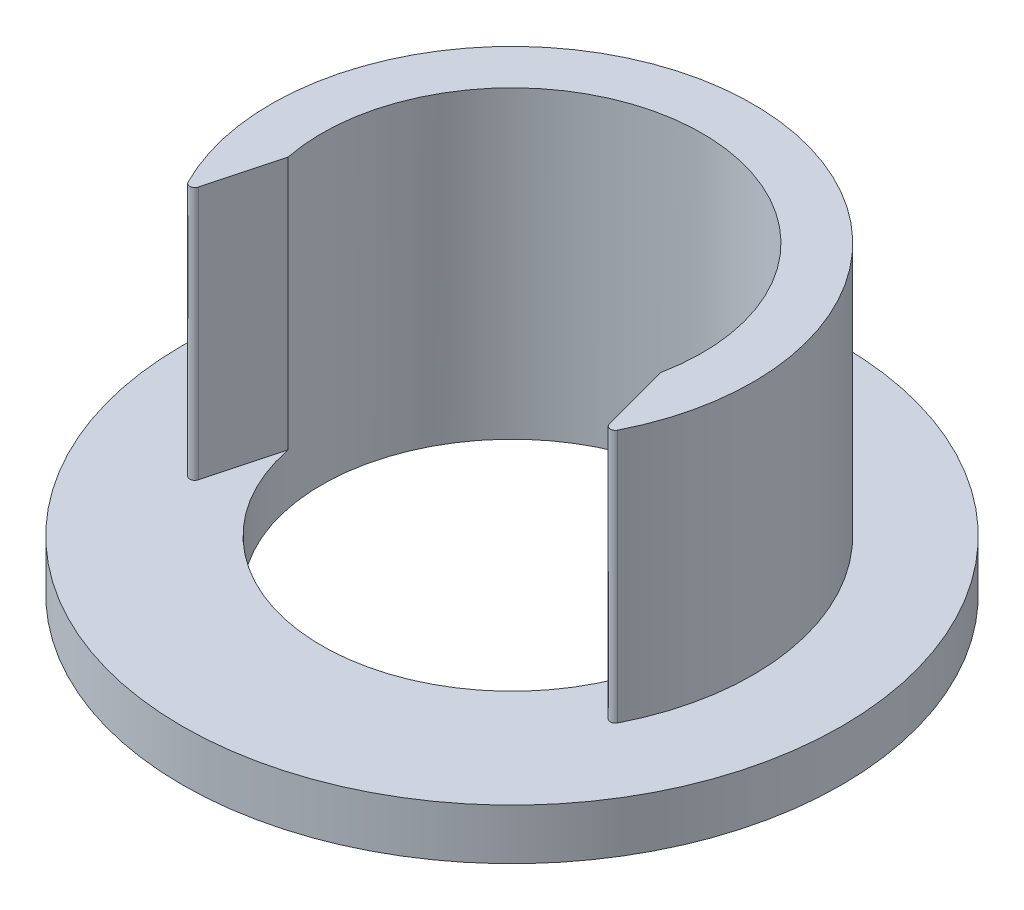
ISO-10303-21;
HEADER;
FILE_DESCRIPTION(('STEP AP214'),'2;1');
FILE_NAME('part.step','',(''),(''),'','','');
FILE_SCHEMA(('AUTOMOTIVE_DESIGN { 1 0 10303 214 1 1 1 1 }'));
ENDSEC;
DATA;
#1=APPLICATION_CONTEXT('core data for automotive mechanical design processes');
#2=APPLICATION_PROTOCOL_DEFINITION('international standard','automotive_design',2000,#1);
#3=PRODUCT_CONTEXT('',#1,'mechanical');
#4=PRODUCT('Part','Part','',(#3));
#5=PRODUCT_RELATED_PRODUCT_CATEGORY('part','',(#4));
#6=PRODUCT_DEFINITION_FORMATION('','',#4);
#7=PRODUCT_DEFINITION_CONTEXT('part definition',#1,'design');
#8=PRODUCT_DEFINITION('design','',#6,#7);
#9=PRODUCT_DEFINITION_SHAPE('','',#8);
#10=(LENGTH_UNIT() NAMED_UNIT(*) SI_UNIT(.MILLI.,.METRE.));
#11=(NAMED_UNIT(*) PLANE_ANGLE_UNIT() SI_UNIT($,.RADIAN.));
#12=(NAMED_UNIT(*) SI_UNIT($,.STERADIAN.) SOLID_ANGLE_UNIT());
#13=UNCERTAINTY_MEASURE_WITH_UNIT(LENGTH_MEASURE(1.E-05),#10,'distance_accuracy_value','');
#14=(GEOMETRIC_REPRESENTATION_CONTEXT(3) GLOBAL_UNCERTAINTY_ASSIGNED_CONTEXT((#13)) GLOBAL_UNIT_ASSIGNED_CONTEXT((#10,
#11,#12)) REPRESENTATION_CONTEXT('',''));
#15=CARTESIAN_POINT('',(0.,0.,0.));
#16=DIRECTION('',(0.,0.,1.));
#17=DIRECTION('',(1.,0.,0.));
#18=AXIS2_PLACEMENT_3D('',#15,#16,#17);
#19=CARTESIAN_POINT('',(0.,10.,0.));
#20=DIRECTION('',(0.,1.,0.));
#21=DIRECTION('',(0.,0.,1.));
#22=AXIS2_PLACEMENT_3D('',#19,#20,#21);
#23=PLANE('',#22);
#24=CARTESIAN_POINT('',(0.,10.,0.));
#25=DIRECTION('',(0.,1.,0.));
#26=DIRECTION('',(0.,0.,-1.));
#27=AXIS2_PLACEMENT_3D('',#24,#25,#26);
#28=CIRCLE('',#27,47.5);
#29=CARTESIAN_POINT('',(42.3445197758314,10.,21.5218875787935));
#30=VERTEX_POINT('',#29);
#31=CARTESIAN_POINT('',(-42.3445197758314,10.,21.5218875787935));
#32=VERTEX_POINT('',#31);
#33=EDGE_CURVE('E159',#30,#32,#28,.T.);
#34=ORIENTED_EDGE('',*,*,#33,.F.);
#35=CARTESIAN_POINT('',(41.4530562016034,10.,21.0687952087136));
#36=DIRECTION('',(0.,1.,0.));
#37=DIRECTION('',(0.,0.,1.));
#38=AXIS2_PLACEMENT_3D('',#35,#36,#37);
#39=CIRCLE('',#38,1.);
#40=CARTESIAN_POINT('',(40.4871303753143,10.,21.3276142538161));
#41=VERTEX_POINT('',#40);
#42=EDGE_CURVE('E48',#30,#41,#39,.F.);
#43=ORIENTED_EDGE('',*,*,#42,.T.);
#44=DIRECTION('',(0.258819045102521,0.,0.965925826289068));
#45=VECTOR('',#44,1.);
#46=CARTESIAN_POINT('',(41.1362066797609,10.,23.7499999999999));
#47=LINE('',#46,#45);
#48=CARTESIAN_POINT('',(36.7594492813252,10.,7.4157190166349));
#49=VERTEX_POINT('',#48);
#50=EDGE_CURVE('E131',#41,#49,#47,.F.);
#51=ORIENTED_EDGE('',*,*,#50,.T.);
#52=CARTESIAN_POINT('',(0.,10.,0.));
#53=DIRECTION('',(0.,1.,0.));
#54=DIRECTION('',(0.,0.,1.));
#55=AXIS2_PLACEMENT_3D('',#52,#53,#54);
#56=CIRCLE('',#55,37.5);
#57=CARTESIAN_POINT('',(-36.7594492813252,10.,7.41571901663502));
#58=VERTEX_POINT('',#57);
#59=EDGE_CURVE('E175',#58,#49,#56,.T.);
#60=ORIENTED_EDGE('',*,*,#59,.F.);
#61=DIRECTION('',(0.258819045102525,0.,-0.965925826289067));
#62=VECTOR('',#61,1.);
#63=CARTESIAN_POINT('',(-36.7594492813252,10.,7.41571901663503));
#64=LINE('',#63,#62);
#65=CARTESIAN_POINT('',(-40.4871303753143,10.,21.3276142538161));
#66=VERTEX_POINT('',#65);
#67=EDGE_CURVE('E117',#58,#66,#64,.F.);
#68=ORIENTED_EDGE('',*,*,#67,.T.);
#69=CARTESIAN_POINT('',(-41.4530562016034,10.,21.0687952087136));
#70=DIRECTION('',(0.,1.,0.));
#71=DIRECTION('',(0.,0.,1.));
#72=AXIS2_PLACEMENT_3D('',#69,#70,#71);
#73=CIRCLE('',#72,1.);
#74=EDGE_CURVE('E11',#66,#32,#73,.F.);
#75=ORIENTED_EDGE('',*,*,#74,.T.);
#76=EDGE_LOOP('',(#34,#43,#51,#60,#68,#75));
#77=FACE_BOUND('',#76,.T.);
#78=CARTESIAN_POINT('',(0.,10.,0.));
#79=DIRECTION('',(0.,1.,0.));
#80=DIRECTION('',(0.,0.,1.));
#81=AXIS2_PLACEMENT_3D('',#78,#79,#80);
#82=CIRCLE('',#81,65.);
#83=CARTESIAN_POINT('',(0.,10.,65.));
#84=VERTEX_POINT('',#83);
#85=EDGE_CURVE('E119',#84,#84,#82,.T.);
#86=ORIENTED_EDGE('',*,*,#85,.T.);
#87=EDGE_LOOP('',(#86));
#88=FACE_BOUND('',#87,.T.);
#89=ADVANCED_FACE('F39',(#77,#88),#23,.T.);
#90=CARTESIAN_POINT('',(0.,0.,0.));
#91=DIRECTION('',(0.,1.,0.));
#92=DIRECTION('',(0.,0.,1.));
#93=AXIS2_PLACEMENT_3D('',#90,#91,#92);
#94=PLANE('',#93);
#95=CARTESIAN_POINT('',(0.,0.,0.));
#96=DIRECTION('',(0.,1.,0.));
#97=DIRECTION('',(0.,0.,1.));
#98=AXIS2_PLACEMENT_3D('',#95,#96,#97);
#99=CIRCLE('',#98,65.);
#100=CARTESIAN_POINT('',(0.,0.,65.));
#101=VERTEX_POINT('',#100);
#102=EDGE_CURVE('E125',#101,#101,#99,.T.);
#103=ORIENTED_EDGE('',*,*,#102,.F.);
#104=EDGE_LOOP('',(#103));
#105=FACE_BOUND('',#104,.T.);
#106=CARTESIAN_POINT('',(0.,0.,0.));
#107=DIRECTION('',(0.,1.,0.));
#108=DIRECTION('',(0.,0.,1.));
#109=AXIS2_PLACEMENT_3D('',#106,#107,#108);
#110=CIRCLE('',#109,37.5);
#111=CARTESIAN_POINT('',(0.,0.,37.5));
#112=VERTEX_POINT('',#111);
#113=EDGE_CURVE('E111',#112,#112,#110,.T.);
#114=ORIENTED_EDGE('',*,*,#113,.T.);
#115=EDGE_LOOP('',(#114));
#116=FACE_BOUND('',#115,.T.);
#117=ADVANCED_FACE('F182',(#105,#116),#94,.F.);
#118=CARTESIAN_POINT('',(0.,10.,0.));
#119=DIRECTION('',(0.,-1.,0.));
#120=DIRECTION('',(0.,0.,-1.));
#121=AXIS2_PLACEMENT_3D('',#118,#119,#120);
#122=CYLINDRICAL_SURFACE('',#121,65.);
#123=ORIENTED_EDGE('',*,*,#85,.F.);
#124=EDGE_LOOP('',(#123));
#125=FACE_BOUND('',#124,.T.);
#126=ORIENTED_EDGE('',*,*,#102,.T.);
#127=EDGE_LOOP('',(#126));
#128=FACE_BOUND('',#127,.T.);
#129=ADVANCED_FACE('F184',(#125,#128),#122,.T.);
#130=CARTESIAN_POINT('',(0.,10.,0.));
#131=DIRECTION('',(0.,-1.,0.));
#132=DIRECTION('',(0.,0.,-1.));
#133=AXIS2_PLACEMENT_3D('',#130,#131,#132);
#134=CYLINDRICAL_SURFACE('',#133,37.5);
#135=ORIENTED_EDGE('',*,*,#59,.T.);
#136=DIRECTION('',(0.,-1.,0.));
#137=VECTOR('',#136,1.);
#138=CARTESIAN_POINT('',(36.7594492813252,10.,7.4157190166349));
#139=LINE('',#138,#137);
#140=CARTESIAN_POINT('',(36.7594492813252,60.,7.4157190166349));
#141=VERTEX_POINT('',#140);
#142=EDGE_CURVE('E101',#49,#141,#139,.F.);
#143=ORIENTED_EDGE('',*,*,#142,.T.);
#144=CARTESIAN_POINT('',(0.,60.,0.));
#145=DIRECTION('',(0.,-1.,0.));
#146=DIRECTION('',(0.,0.,1.));
#147=AXIS2_PLACEMENT_3D('',#144,#145,#146);
#148=CIRCLE('',#147,37.5);
#149=CARTESIAN_POINT('',(-36.7594492813252,60.,7.41571901663502));
#150=VERTEX_POINT('',#149);
#151=EDGE_CURVE('E95',#150,#141,#148,.T.);
#152=ORIENTED_EDGE('',*,*,#151,.F.);
#153=DIRECTION('',(0.,-1.,0.));
#154=VECTOR('',#153,1.);
#155=CARTESIAN_POINT('',(-36.7594492813252,10.,7.41571901663502));
#156=LINE('',#155,#154);
#157=EDGE_CURVE('E108',#150,#58,#156,.T.);
#158=ORIENTED_EDGE('',*,*,#157,.T.);
#159=EDGE_LOOP('',(#135,#143,#152,#158));
#160=FACE_BOUND('',#159,.T.);
#161=ORIENTED_EDGE('',*,*,#113,.F.);
#162=EDGE_LOOP('',(#161));
#163=FACE_BOUND('',#162,.T.);
#164=ADVANCED_FACE('F106',(#160,#163),#134,.F.);
#165=CARTESIAN_POINT('',(0.,60.,0.));
#166=DIRECTION('',(0.,-1.,0.));
#167=DIRECTION('',(0.,0.,-1.));
#168=AXIS2_PLACEMENT_3D('',#165,#166,#167);
#169=CYLINDRICAL_SURFACE('',#168,47.5);
#170=CARTESIAN_POINT('',(0.,60.,0.));
#171=DIRECTION('',(0.,1.,0.));
#172=DIRECTION('',(0.,0.,-1.));
#173=AXIS2_PLACEMENT_3D('',#170,#171,#172);
#174=CIRCLE('',#173,47.5);
#175=CARTESIAN_POINT('',(42.3445197758314,60.,21.5218875787935));
#176=VERTEX_POINT('',#175);
#177=CARTESIAN_POINT('',(-42.3445197758314,60.,21.5218875787935));
#178=VERTEX_POINT('',#177);
#179=EDGE_CURVE('E112',#176,#178,#174,.T.);
#180=ORIENTED_EDGE('',*,*,#179,.F.);
#181=DIRECTION('',(0.,-1.,0.));
#182=VECTOR('',#181,1.);
#183=CARTESIAN_POINT('',(42.3445197758314,60.,21.5218875787935));
#184=LINE('',#183,#182);
#185=EDGE_CURVE('E139',#176,#30,#184,.T.);
#186=ORIENTED_EDGE('',*,*,#185,.T.);
#187=ORIENTED_EDGE('',*,*,#33,.T.);
#188=DIRECTION('',(0.,-1.,0.));
#189=VECTOR('',#188,1.);
#190=CARTESIAN_POINT('',(-42.3445197758314,60.,21.5218875787935));
#191=LINE('',#190,#189);
#192=EDGE_CURVE('E136',#32,#178,#191,.F.);
#193=ORIENTED_EDGE('',*,*,#192,.T.);
#194=EDGE_LOOP('',(#180,#186,#187,#193));
#195=FACE_BOUND('',#194,.T.);
#196=ADVANCED_FACE('F169',(#195),#169,.T.);
#197=CARTESIAN_POINT('',(0.,60.,0.));
#198=DIRECTION('',(0.,-1.,0.));
#199=DIRECTION('',(0.,0.,-1.));
#200=AXIS2_PLACEMENT_3D('',#197,#198,#199);
#201=PLANE('',#200);
#202=DIRECTION('',(-0.258819045102521,0.,-0.965925826289068));
#203=VECTOR('',#202,1.);
#204=CARTESIAN_POINT('',(41.1362066797609,60.,23.7499999999999));
#205=LINE('',#204,#203);
#206=CARTESIAN_POINT('',(40.4871303753143,60.,21.3276142538161));
#207=VERTEX_POINT('',#206);
#208=EDGE_CURVE('E100',#141,#207,#205,.F.);
#209=ORIENTED_EDGE('',*,*,#208,.T.);
#210=CARTESIAN_POINT('',(41.4530562016034,60.,21.0687952087136));
#211=DIRECTION('',(0.,-1.,0.));
#212=DIRECTION('',(0.,0.,-1.));
#213=AXIS2_PLACEMENT_3D('',#210,#211,#212);
#214=CIRCLE('',#213,1.);
#215=EDGE_CURVE('E148',#207,#176,#214,.F.);
#216=ORIENTED_EDGE('',*,*,#215,.T.);
#217=ORIENTED_EDGE('',*,*,#179,.T.);
#218=CARTESIAN_POINT('',(-41.4530562016034,60.,21.0687952087136));
#219=DIRECTION('',(0.,-1.,0.));
#220=DIRECTION('',(0.,0.,-1.));
#221=AXIS2_PLACEMENT_3D('',#218,#219,#220);
#222=CIRCLE('',#221,1.);
#223=CARTESIAN_POINT('',(-40.4871303753143,60.,21.3276142538161));
#224=VERTEX_POINT('',#223);
#225=EDGE_CURVE('E61',#178,#224,#222,.F.);
#226=ORIENTED_EDGE('',*,*,#225,.T.);
#227=DIRECTION('',(-0.258819045102525,0.,0.965925826289067));
#228=VECTOR('',#227,1.);
#229=CARTESIAN_POINT('',(-36.7594492813252,60.,7.41571901663503));
#230=LINE('',#229,#228);
#231=EDGE_CURVE('E91',#224,#150,#230,.F.);
#232=ORIENTED_EDGE('',*,*,#231,.T.);
#233=ORIENTED_EDGE('',*,*,#151,.T.);
#234=EDGE_LOOP('',(#209,#216,#217,#226,#232,#233));
#235=FACE_BOUND('',#234,.T.);
#236=ADVANCED_FACE('F94',(#235),#201,.F.);
#237=CARTESIAN_POINT('',(41.1362066797609,10.,23.7499999999999));
#238=DIRECTION('',(0.965925826289068,0.,-0.258819045102521));
#239=DIRECTION('',(0.,-1.,0.));
#240=AXIS2_PLACEMENT_3D('',#237,#238,#239);
#241=PLANE('',#240);
#242=ORIENTED_EDGE('',*,*,#50,.F.);
#243=DIRECTION('',(0.,-1.,0.));
#244=VECTOR('',#243,1.);
#245=CARTESIAN_POINT('',(40.4871303753143,60.,21.3276142538161));
#246=LINE('',#245,#244);
#247=EDGE_CURVE('E143',#41,#207,#246,.F.);
#248=ORIENTED_EDGE('',*,*,#247,.T.);
#249=ORIENTED_EDGE('',*,*,#208,.F.);
#250=ORIENTED_EDGE('',*,*,#142,.F.);
#251=EDGE_LOOP('',(#242,#248,#249,#250));
#252=FACE_BOUND('',#251,.T.);
#253=ADVANCED_FACE('F164',(#252),#241,.F.);
#254=CARTESIAN_POINT('',(-36.7594492813252,10.,7.41571901663503));
#255=DIRECTION('',(-0.965925826289067,0.,-0.258819045102525));
#256=DIRECTION('',(0.,-1.,0.));
#257=AXIS2_PLACEMENT_3D('',#254,#255,#256);
#258=PLANE('',#257);
#259=ORIENTED_EDGE('',*,*,#231,.F.);
#260=DIRECTION('',(0.,-1.,0.));
#261=VECTOR('',#260,1.);
#262=CARTESIAN_POINT('',(-40.4871303753143,10.,21.3276142538161));
#263=LINE('',#262,#261);
#264=EDGE_CURVE('E151',#224,#66,#263,.T.);
#265=ORIENTED_EDGE('',*,*,#264,.T.);
#266=ORIENTED_EDGE('',*,*,#67,.F.);
#267=ORIENTED_EDGE('',*,*,#157,.F.);
#268=EDGE_LOOP('',(#259,#265,#266,#267));
#269=FACE_BOUND('',#268,.T.);
#270=ADVANCED_FACE('F115',(#269),#258,.F.);
#271=CARTESIAN_POINT('',(41.4530562016034,60.,21.0687952087136));
#272=DIRECTION('',(0.,-1.,0.));
#273=DIRECTION('',(0.,0.,-1.));
#274=AXIS2_PLACEMENT_3D('',#271,#272,#273);
#275=CYLINDRICAL_SURFACE('',#274,1.);
#276=ORIENTED_EDGE('',*,*,#215,.F.);
#277=ORIENTED_EDGE('',*,*,#247,.F.);
#278=ORIENTED_EDGE('',*,*,#42,.F.);
#279=ORIENTED_EDGE('',*,*,#185,.F.);
#280=EDGE_LOOP('',(#276,#277,#278,#279));
#281=FACE_BOUND('',#280,.T.);
#282=ADVANCED_FACE('F166',(#281),#275,.T.);
#283=CARTESIAN_POINT('',(-41.4530562016034,60.,21.0687952087136));
#284=DIRECTION('',(0.,-1.,0.));
#285=DIRECTION('',(0.,0.,-1.));
#286=AXIS2_PLACEMENT_3D('',#283,#284,#285);
#287=CYLINDRICAL_SURFACE('',#286,1.);
#288=ORIENTED_EDGE('',*,*,#225,.F.);
#289=ORIENTED_EDGE('',*,*,#192,.F.);
#290=ORIENTED_EDGE('',*,*,#74,.F.);
#291=ORIENTED_EDGE('',*,*,#264,.F.);
#292=EDGE_LOOP('',(#288,#289,#290,#291));
#293=FACE_BOUND('',#292,.T.);
#294=ADVANCED_FACE('F41',(#293),#287,.T.);
#295=CLOSED_SHELL('',(#89,#117,#129,#164,#196,#236,#253,#270,#282,#294));
#296=MANIFOLD_SOLID_BREP('B2',#295);
#297=ADVANCED_BREP_SHAPE_REPRESENTATION('',(#18,#296),#14);
#298=SHAPE_DEFINITION_REPRESENTATION(#9,#297);
ENDSEC;
END-ISO-10303-21;
